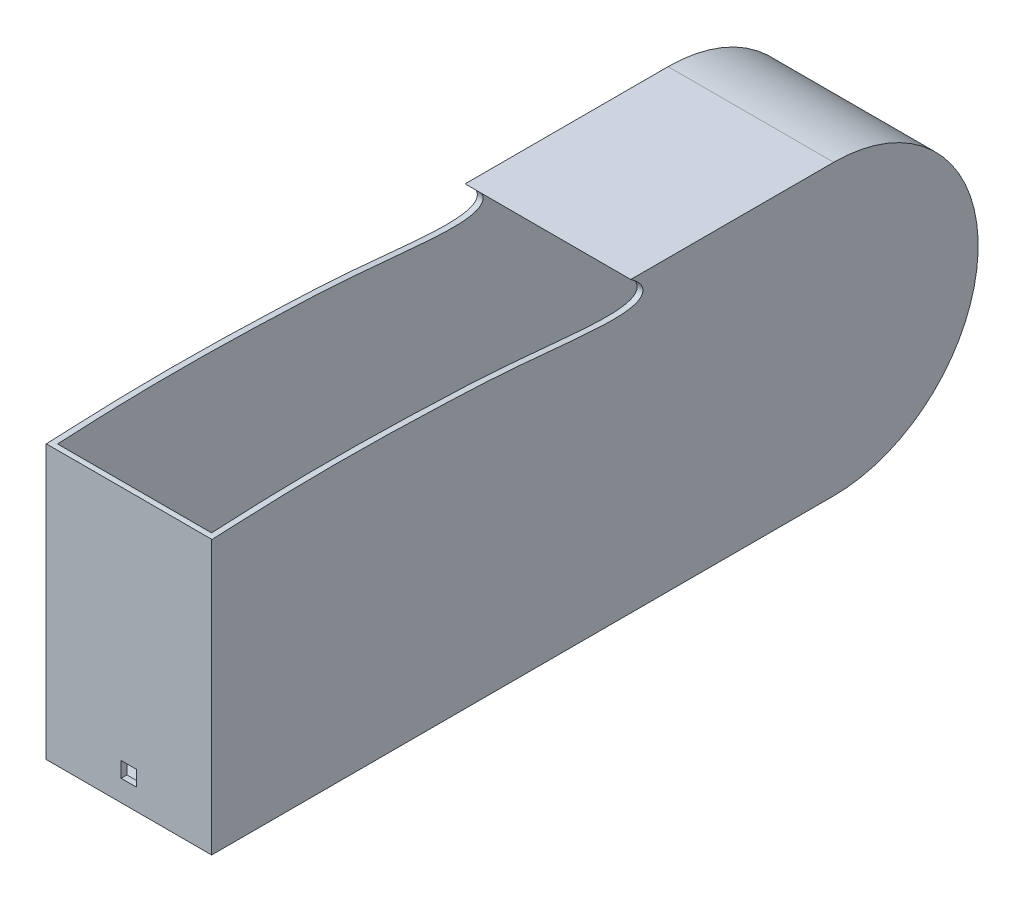
ISO-10303-21;
HEADER;
FILE_DESCRIPTION(('STEP AP214'),'2;1');
FILE_NAME('part.step','',(''),(''),'','','');
FILE_SCHEMA(('AUTOMOTIVE_DESIGN { 1 0 10303 214 1 1 1 1 }'));
ENDSEC;
DATA;
#1=APPLICATION_CONTEXT('core data for automotive mechanical design processes');
#2=APPLICATION_PROTOCOL_DEFINITION('international standard','automotive_design',2000,#1);
#3=PRODUCT_CONTEXT('',#1,'mechanical');
#4=PRODUCT('Part','Part','',(#3));
#5=PRODUCT_RELATED_PRODUCT_CATEGORY('part','',(#4));
#6=PRODUCT_DEFINITION_FORMATION('','',#4);
#7=PRODUCT_DEFINITION_CONTEXT('part definition',#1,'design');
#8=PRODUCT_DEFINITION('design','',#6,#7);
#9=PRODUCT_DEFINITION_SHAPE('','',#8);
#10=(LENGTH_UNIT() NAMED_UNIT(*) SI_UNIT(.MILLI.,.METRE.));
#11=(NAMED_UNIT(*) PLANE_ANGLE_UNIT() SI_UNIT($,.RADIAN.));
#12=(NAMED_UNIT(*) SI_UNIT($,.STERADIAN.) SOLID_ANGLE_UNIT());
#13=UNCERTAINTY_MEASURE_WITH_UNIT(LENGTH_MEASURE(1.E-05),#10,'distance_accuracy_value','');
#14=(GEOMETRIC_REPRESENTATION_CONTEXT(3) GLOBAL_UNCERTAINTY_ASSIGNED_CONTEXT((#13)) GLOBAL_UNIT_ASSIGNED_CONTEXT((#10,
#11,#12)) REPRESENTATION_CONTEXT('',''));
#15=CARTESIAN_POINT('',(0.,0.,0.));
#16=DIRECTION('',(0.,0.,1.));
#17=DIRECTION('',(1.,0.,0.));
#18=AXIS2_PLACEMENT_3D('',#15,#16,#17);
#19=CARTESIAN_POINT('',(-63.5,114.3,0.));
#20=DIRECTION('',(1.,0.,0.));
#21=DIRECTION('',(0.,0.,-1.));
#22=AXIS2_PLACEMENT_3D('',#19,#20,#21);
#23=CYLINDRICAL_SURFACE('',#22,119.0625);
#24=DIRECTION('',(1.,0.,0.));
#25=VECTOR('',#24,1.);
#26=CARTESIAN_POINT('',(-63.5,233.3625,0.));
#27=LINE('',#26,#25);
#28=CARTESIAN_POINT('',(-68.2625,233.3625,0.));
#29=VERTEX_POINT('',#28);
#30=CARTESIAN_POINT('',(68.2625,233.3625,0.));
#31=VERTEX_POINT('',#30);
#32=EDGE_CURVE('E165',#29,#31,#27,.T.);
#33=ORIENTED_EDGE('',*,*,#32,.T.);
#34=CARTESIAN_POINT('',(68.2625,114.3,0.));
#35=DIRECTION('',(1.,0.,0.));
#36=DIRECTION('',(0.,0.,-1.));
#37=AXIS2_PLACEMENT_3D('',#34,#35,#36);
#38=CIRCLE('',#37,119.0625);
#39=CARTESIAN_POINT('',(68.2625,-4.76249999999989,0.));
#40=VERTEX_POINT('',#39);
#41=EDGE_CURVE('E149',#40,#31,#38,.T.);
#42=ORIENTED_EDGE('',*,*,#41,.F.);
#43=DIRECTION('',(1.,0.,0.));
#44=VECTOR('',#43,1.);
#45=CARTESIAN_POINT('',(-63.5,-4.7625,0.));
#46=LINE('',#45,#44);
#47=CARTESIAN_POINT('',(-68.2625,-4.76249999999989,0.));
#48=VERTEX_POINT('',#47);
#49=EDGE_CURVE('E145',#48,#40,#46,.T.);
#50=ORIENTED_EDGE('',*,*,#49,.F.);
#51=CARTESIAN_POINT('',(-68.2625,114.3,0.));
#52=DIRECTION('',(1.,0.,0.));
#53=DIRECTION('',(0.,0.,-1.));
#54=AXIS2_PLACEMENT_3D('',#51,#52,#53);
#55=CIRCLE('',#54,119.0625);
#56=EDGE_CURVE('E147',#48,#29,#55,.T.);
#57=ORIENTED_EDGE('',*,*,#56,.T.);
#58=EDGE_LOOP('',(#33,#42,#50,#57));
#59=FACE_BOUND('',#58,.T.);
#60=ADVANCED_FACE('F41',(#59),#23,.T.);
#61=CARTESIAN_POINT('',(-63.5,-4.7625,0.));
#62=DIRECTION('',(0.,-1.,0.));
#63=DIRECTION('',(0.,0.,-1.));
#64=AXIS2_PLACEMENT_3D('',#61,#62,#63);
#65=PLANE('',#64);
#66=ORIENTED_EDGE('',*,*,#49,.T.);
#67=DIRECTION('',(0.,0.,-1.));
#68=VECTOR('',#67,1.);
#69=CARTESIAN_POINT('',(68.2625,-4.76249999999989,512.7625));
#70=LINE('',#69,#68);
#71=CARTESIAN_POINT('',(68.2625,-4.76249999999989,512.7625));
#72=VERTEX_POINT('',#71);
#73=EDGE_CURVE('E178',#72,#40,#70,.T.);
#74=ORIENTED_EDGE('',*,*,#73,.F.);
#75=DIRECTION('',(1.,0.,0.));
#76=VECTOR('',#75,1.);
#77=CARTESIAN_POINT('',(-63.5,-4.76250000000006,512.7625));
#78=LINE('',#77,#76);
#79=CARTESIAN_POINT('',(-68.2625,-4.76249999999989,512.7625));
#80=VERTEX_POINT('',#79);
#81=EDGE_CURVE('E170',#80,#72,#78,.T.);
#82=ORIENTED_EDGE('',*,*,#81,.F.);
#83=DIRECTION('',(0.,0.,-1.));
#84=VECTOR('',#83,1.);
#85=CARTESIAN_POINT('',(-68.2625,-4.76249999999989,512.7625));
#86=LINE('',#85,#84);
#87=EDGE_CURVE('E155',#80,#48,#86,.T.);
#88=ORIENTED_EDGE('',*,*,#87,.T.);
#89=EDGE_LOOP('',(#66,#74,#82,#88));
#90=FACE_BOUND('',#89,.T.);
#91=ADVANCED_FACE('F168',(#90),#65,.T.);
#92=CARTESIAN_POINT('',(-63.5,-4.76250000000006,512.7625));
#93=DIRECTION('',(0.,0.,1.));
#94=DIRECTION('',(1.,0.,0.));
#95=AXIS2_PLACEMENT_3D('',#92,#93,#94);
#96=PLANE('',#95);
#97=DIRECTION('',(-1.,0.,0.));
#98=VECTOR('',#97,1.);
#99=CARTESIAN_POINT('',(68.2635,220.6625,512.7625));
#100=LINE('',#99,#98);
#101=CARTESIAN_POINT('',(68.2625,220.6625,512.7625));
#102=VERTEX_POINT('',#101);
#103=CARTESIAN_POINT('',(-68.2625,220.6625,512.7625));
#104=VERTEX_POINT('',#103);
#105=EDGE_CURVE('E172',#102,#104,#100,.T.);
#106=ORIENTED_EDGE('',*,*,#105,.T.);
#107=DIRECTION('',(0.,-1.,0.));
#108=VECTOR('',#107,1.);
#109=CARTESIAN_POINT('',(-68.2625,233.3625,512.7625));
#110=LINE('',#109,#108);
#111=EDGE_CURVE('E175',#104,#80,#110,.T.);
#112=ORIENTED_EDGE('',*,*,#111,.T.);
#113=ORIENTED_EDGE('',*,*,#81,.T.);
#114=DIRECTION('',(0.,-1.,0.));
#115=VECTOR('',#114,1.);
#116=CARTESIAN_POINT('',(68.2625,233.3625,512.7625));
#117=LINE('',#116,#115);
#118=EDGE_CURVE('E210',#102,#72,#117,.T.);
#119=ORIENTED_EDGE('',*,*,#118,.F.);
#120=EDGE_LOOP('',(#106,#112,#113,#119));
#121=FACE_BOUND('',#120,.T.);
#122=DIRECTION('',(1.,0.,0.));
#123=VECTOR('',#122,1.);
#124=CARTESIAN_POINT('',(-6.35,12.7,512.7625));
#125=LINE('',#124,#123);
#126=CARTESIAN_POINT('',(-6.35,12.7,512.7625));
#127=VERTEX_POINT('',#126);
#128=CARTESIAN_POINT('',(6.35,12.7,512.7625));
#129=VERTEX_POINT('',#128);
#130=EDGE_CURVE('E268',#127,#129,#125,.T.);
#131=ORIENTED_EDGE('',*,*,#130,.F.);
#132=DIRECTION('',(0.,-1.,0.));
#133=VECTOR('',#132,1.);
#134=CARTESIAN_POINT('',(-6.35,25.4,512.7625));
#135=LINE('',#134,#133);
#136=CARTESIAN_POINT('',(-6.35,25.4,512.7625));
#137=VERTEX_POINT('',#136);
#138=EDGE_CURVE('E229',#137,#127,#135,.T.);
#139=ORIENTED_EDGE('',*,*,#138,.F.);
#140=DIRECTION('',(-1.,0.,0.));
#141=VECTOR('',#140,1.);
#142=CARTESIAN_POINT('',(-6.35,25.4,512.7625));
#143=LINE('',#142,#141);
#144=CARTESIAN_POINT('',(6.35,25.4,512.7625));
#145=VERTEX_POINT('',#144);
#146=EDGE_CURVE('E278',#145,#137,#143,.T.);
#147=ORIENTED_EDGE('',*,*,#146,.F.);
#148=DIRECTION('',(0.,1.,0.));
#149=VECTOR('',#148,1.);
#150=CARTESIAN_POINT('',(6.35,25.4,512.7625));
#151=LINE('',#150,#149);
#152=EDGE_CURVE('E273',#129,#145,#151,.T.);
#153=ORIENTED_EDGE('',*,*,#152,.F.);
#154=EDGE_LOOP('',(#131,#139,#147,#153));
#155=FACE_BOUND('',#154,.T.);
#156=ADVANCED_FACE('F313',(#121,#155),#96,.T.);
#157=CARTESIAN_POINT('',(-63.5,233.3625,512.7625));
#158=DIRECTION('',(0.,1.,0.));
#159=DIRECTION('',(0.,0.,1.));
#160=AXIS2_PLACEMENT_3D('',#157,#158,#159);
#161=PLANE('',#160);
#162=DIRECTION('',(-1.,0.,0.));
#163=VECTOR('',#162,1.);
#164=CARTESIAN_POINT('',(68.2635,233.3625,167.294140697003));
#165=LINE('',#164,#163);
#166=CARTESIAN_POINT('',(-68.2625,233.3625,167.294140697006));
#167=VERTEX_POINT('',#166);
#168=CARTESIAN_POINT('',(68.2625,233.3625,167.294140697006));
#169=VERTEX_POINT('',#168);
#170=EDGE_CURVE('E86',#167,#169,#165,.F.);
#171=ORIENTED_EDGE('',*,*,#170,.T.);
#172=DIRECTION('',(0.,0.,1.));
#173=VECTOR('',#172,1.);
#174=CARTESIAN_POINT('',(68.2625,233.3625,512.7625));
#175=LINE('',#174,#173);
#176=EDGE_CURVE('E197',#31,#169,#175,.T.);
#177=ORIENTED_EDGE('',*,*,#176,.F.);
#178=ORIENTED_EDGE('',*,*,#32,.F.);
#179=DIRECTION('',(0.,0.,1.));
#180=VECTOR('',#179,1.);
#181=CARTESIAN_POINT('',(-68.2625,233.3625,512.7625));
#182=LINE('',#181,#180);
#183=EDGE_CURVE('E163',#29,#167,#182,.T.);
#184=ORIENTED_EDGE('',*,*,#183,.T.);
#185=EDGE_LOOP('',(#171,#177,#178,#184));
#186=FACE_BOUND('',#185,.T.);
#187=ADVANCED_FACE('F362',(#186),#161,.T.);
#188=CARTESIAN_POINT('',(-63.5,114.3,0.));
#189=DIRECTION('',(1.,0.,0.));
#190=DIRECTION('',(0.,0.,-1.));
#191=AXIS2_PLACEMENT_3D('',#188,#189,#190);
#192=CYLINDRICAL_SURFACE('',#191,114.3);
#193=DIRECTION('',(1.,0.,0.));
#194=VECTOR('',#193,1.);
#195=CARTESIAN_POINT('',(-63.5,0.,0.));
#196=LINE('',#195,#194);
#197=CARTESIAN_POINT('',(-63.5,0.,0.));
#198=VERTEX_POINT('',#197);
#199=CARTESIAN_POINT('',(63.5,0.,0.));
#200=VERTEX_POINT('',#199);
#201=EDGE_CURVE('E216',#198,#200,#196,.T.);
#202=ORIENTED_EDGE('',*,*,#201,.T.);
#203=CARTESIAN_POINT('',(63.5,114.3,0.));
#204=DIRECTION('',(1.,0.,0.));
#205=DIRECTION('',(0.,0.,-1.));
#206=AXIS2_PLACEMENT_3D('',#203,#204,#205);
#207=CIRCLE('',#206,114.3);
#208=CARTESIAN_POINT('',(63.5,228.6,0.));
#209=VERTEX_POINT('',#208);
#210=EDGE_CURVE('E261',#200,#209,#207,.T.);
#211=ORIENTED_EDGE('',*,*,#210,.T.);
#212=DIRECTION('',(1.,0.,0.));
#213=VECTOR('',#212,1.);
#214=CARTESIAN_POINT('',(-63.5,228.6,0.));
#215=LINE('',#214,#213);
#216=CARTESIAN_POINT('',(-63.5,228.6,0.));
#217=VERTEX_POINT('',#216);
#218=EDGE_CURVE('E206',#217,#209,#215,.T.);
#219=ORIENTED_EDGE('',*,*,#218,.F.);
#220=CARTESIAN_POINT('',(-63.5,114.3,0.));
#221=DIRECTION('',(1.,0.,0.));
#222=DIRECTION('',(0.,0.,-1.));
#223=AXIS2_PLACEMENT_3D('',#220,#221,#222);
#224=CIRCLE('',#223,114.3);
#225=EDGE_CURVE('E243',#198,#217,#224,.T.);
#226=ORIENTED_EDGE('',*,*,#225,.F.);
#227=EDGE_LOOP('',(#202,#211,#219,#226));
#228=FACE_BOUND('',#227,.T.);
#229=ADVANCED_FACE('F327',(#228),#192,.F.);
#230=CARTESIAN_POINT('',(-63.5,0.,0.));
#231=DIRECTION('',(0.,-1.,0.));
#232=DIRECTION('',(0.,0.,-1.));
#233=AXIS2_PLACEMENT_3D('',#230,#231,#232);
#234=PLANE('',#233);
#235=DIRECTION('',(1.,0.,0.));
#236=VECTOR('',#235,1.);
#237=CARTESIAN_POINT('',(-63.5,0.,508.));
#238=LINE('',#237,#236);
#239=CARTESIAN_POINT('',(-63.5,0.,508.));
#240=VERTEX_POINT('',#239);
#241=CARTESIAN_POINT('',(63.5,0.,508.));
#242=VERTEX_POINT('',#241);
#243=EDGE_CURVE('E260',#240,#242,#238,.T.);
#244=ORIENTED_EDGE('',*,*,#243,.T.);
#245=DIRECTION('',(0.,0.,-1.));
#246=VECTOR('',#245,1.);
#247=CARTESIAN_POINT('',(63.5,0.,0.));
#248=LINE('',#247,#246);
#249=EDGE_CURVE('E202',#242,#200,#248,.T.);
#250=ORIENTED_EDGE('',*,*,#249,.T.);
#251=ORIENTED_EDGE('',*,*,#201,.F.);
#252=DIRECTION('',(0.,0.,-1.));
#253=VECTOR('',#252,1.);
#254=CARTESIAN_POINT('',(-63.5,0.,0.));
#255=LINE('',#254,#253);
#256=EDGE_CURVE('E191',#240,#198,#255,.T.);
#257=ORIENTED_EDGE('',*,*,#256,.F.);
#258=EDGE_LOOP('',(#244,#250,#251,#257));
#259=FACE_BOUND('',#258,.T.);
#260=ADVANCED_FACE('F331',(#259),#234,.F.);
#261=CARTESIAN_POINT('',(-63.5,0.,508.));
#262=DIRECTION('',(0.,0.,1.));
#263=DIRECTION('',(1.,0.,0.));
#264=AXIS2_PLACEMENT_3D('',#261,#262,#263);
#265=PLANE('',#264);
#266=DIRECTION('',(0.,1.,0.));
#267=VECTOR('',#266,1.);
#268=CARTESIAN_POINT('',(-6.35,25.4,508.));
#269=LINE('',#268,#267);
#270=CARTESIAN_POINT('',(-6.35,12.7,508.));
#271=VERTEX_POINT('',#270);
#272=CARTESIAN_POINT('',(-6.35,25.4,508.));
#273=VERTEX_POINT('',#272);
#274=EDGE_CURVE('E284',#271,#273,#269,.T.);
#275=ORIENTED_EDGE('',*,*,#274,.F.);
#276=DIRECTION('',(-1.,0.,0.));
#277=VECTOR('',#276,1.);
#278=CARTESIAN_POINT('',(-6.35,12.7,508.));
#279=LINE('',#278,#277);
#280=CARTESIAN_POINT('',(6.35,12.7,508.));
#281=VERTEX_POINT('',#280);
#282=EDGE_CURVE('E269',#281,#271,#279,.T.);
#283=ORIENTED_EDGE('',*,*,#282,.F.);
#284=DIRECTION('',(0.,-1.,0.));
#285=VECTOR('',#284,1.);
#286=CARTESIAN_POINT('',(6.35,25.4,508.));
#287=LINE('',#286,#285);
#288=CARTESIAN_POINT('',(6.35,25.4,508.));
#289=VERTEX_POINT('',#288);
#290=EDGE_CURVE('E274',#289,#281,#287,.T.);
#291=ORIENTED_EDGE('',*,*,#290,.F.);
#292=DIRECTION('',(1.,0.,0.));
#293=VECTOR('',#292,1.);
#294=CARTESIAN_POINT('',(-6.35,25.4,508.));
#295=LINE('',#294,#293);
#296=EDGE_CURVE('E279',#273,#289,#295,.T.);
#297=ORIENTED_EDGE('',*,*,#296,.F.);
#298=EDGE_LOOP('',(#275,#283,#291,#297));
#299=FACE_BOUND('',#298,.T.);
#300=DIRECTION('',(0.,-1.,0.));
#301=VECTOR('',#300,1.);
#302=CARTESIAN_POINT('',(-63.5,0.,508.));
#303=LINE('',#302,#301);
#304=CARTESIAN_POINT('',(-63.5,220.431417677347,508.));
#305=VERTEX_POINT('',#304);
#306=EDGE_CURVE('E188',#305,#240,#303,.T.);
#307=ORIENTED_EDGE('',*,*,#306,.F.);
#308=DIRECTION('',(-1.,0.,0.));
#309=VECTOR('',#308,1.);
#310=CARTESIAN_POINT('',(68.2635,220.431417677364,508.));
#311=LINE('',#310,#309);
#312=CARTESIAN_POINT('',(63.5,220.431417677347,508.000000003168));
#313=VERTEX_POINT('',#312);
#314=EDGE_CURVE('E183',#313,#305,#311,.T.);
#315=ORIENTED_EDGE('',*,*,#314,.F.);
#316=DIRECTION('',(0.,-1.,0.));
#317=VECTOR('',#316,1.);
#318=CARTESIAN_POINT('',(63.5,0.,508.));
#319=LINE('',#318,#317);
#320=EDGE_CURVE('E198',#313,#242,#319,.T.);
#321=ORIENTED_EDGE('',*,*,#320,.T.);
#322=ORIENTED_EDGE('',*,*,#243,.F.);
#323=EDGE_LOOP('',(#307,#315,#321,#322));
#324=FACE_BOUND('',#323,.T.);
#325=ADVANCED_FACE('F43',(#299,#324),#265,.F.);
#326=CARTESIAN_POINT('',(-63.5,228.6,508.));
#327=DIRECTION('',(0.,1.,0.));
#328=DIRECTION('',(0.,0.,1.));
#329=AXIS2_PLACEMENT_3D('',#326,#327,#328);
#330=PLANE('',#329);
#331=DIRECTION('',(0.,0.,1.));
#332=VECTOR('',#331,1.);
#333=CARTESIAN_POINT('',(63.5,228.6,508.));
#334=LINE('',#333,#332);
#335=CARTESIAN_POINT('',(63.5,228.600000000172,161.549426199664));
#336=VERTEX_POINT('',#335);
#337=EDGE_CURVE('E201',#209,#336,#334,.T.);
#338=ORIENTED_EDGE('',*,*,#337,.T.);
#339=DIRECTION('',(-1.,0.,0.));
#340=VECTOR('',#339,1.);
#341=CARTESIAN_POINT('',(68.2635,228.6,161.549426199493));
#342=LINE('',#341,#340);
#343=CARTESIAN_POINT('',(-63.5,228.6,161.549426199664));
#344=VERTEX_POINT('',#343);
#345=EDGE_CURVE('E54',#344,#336,#342,.F.);
#346=ORIENTED_EDGE('',*,*,#345,.F.);
#347=DIRECTION('',(0.,0.,1.));
#348=VECTOR('',#347,1.);
#349=CARTESIAN_POINT('',(-63.5,228.6,508.));
#350=LINE('',#349,#348);
#351=EDGE_CURVE('E193',#217,#344,#350,.T.);
#352=ORIENTED_EDGE('',*,*,#351,.F.);
#353=ORIENTED_EDGE('',*,*,#218,.T.);
#354=EDGE_LOOP('',(#338,#346,#352,#353));
#355=FACE_BOUND('',#354,.T.);
#356=ADVANCED_FACE('F339',(#355),#330,.F.);
#357=CARTESIAN_POINT('',(-6.35,12.7,-119.0635));
#358=DIRECTION('',(0.,-1.,0.));
#359=DIRECTION('',(0.,0.,-1.));
#360=AXIS2_PLACEMENT_3D('',#357,#358,#359);
#361=PLANE('',#360);
#362=ORIENTED_EDGE('',*,*,#282,.T.);
#363=DIRECTION('',(0.,0.,1.));
#364=VECTOR('',#363,1.);
#365=CARTESIAN_POINT('',(-6.35,12.7,-119.0635));
#366=LINE('',#365,#364);
#367=EDGE_CURVE('E265',#271,#127,#366,.T.);
#368=ORIENTED_EDGE('',*,*,#367,.T.);
#369=ORIENTED_EDGE('',*,*,#130,.T.);
#370=DIRECTION('',(0.,0.,1.));
#371=VECTOR('',#370,1.);
#372=CARTESIAN_POINT('',(6.35,12.7,-119.0635));
#373=LINE('',#372,#371);
#374=EDGE_CURVE('E270',#281,#129,#373,.T.);
#375=ORIENTED_EDGE('',*,*,#374,.F.);
#376=EDGE_LOOP('',(#362,#368,#369,#375));
#377=FACE_BOUND('',#376,.T.);
#378=ADVANCED_FACE('F351',(#377),#361,.F.);
#379=CARTESIAN_POINT('',(6.35,25.4,-119.0635));
#380=DIRECTION('',(1.,0.,0.));
#381=DIRECTION('',(0.,1.,0.));
#382=AXIS2_PLACEMENT_3D('',#379,#380,#381);
#383=PLANE('',#382);
#384=ORIENTED_EDGE('',*,*,#290,.T.);
#385=ORIENTED_EDGE('',*,*,#374,.T.);
#386=ORIENTED_EDGE('',*,*,#152,.T.);
#387=DIRECTION('',(0.,0.,1.));
#388=VECTOR('',#387,1.);
#389=CARTESIAN_POINT('',(6.35,25.4,-119.0635));
#390=LINE('',#389,#388);
#391=EDGE_CURVE('E275',#289,#145,#390,.T.);
#392=ORIENTED_EDGE('',*,*,#391,.F.);
#393=EDGE_LOOP('',(#384,#385,#386,#392));
#394=FACE_BOUND('',#393,.T.);
#395=ADVANCED_FACE('F366',(#394),#383,.F.);
#396=CARTESIAN_POINT('',(-6.35,25.4,-119.0635));
#397=DIRECTION('',(0.,1.,0.));
#398=DIRECTION('',(0.,0.,1.));
#399=AXIS2_PLACEMENT_3D('',#396,#397,#398);
#400=PLANE('',#399);
#401=ORIENTED_EDGE('',*,*,#296,.T.);
#402=ORIENTED_EDGE('',*,*,#391,.T.);
#403=ORIENTED_EDGE('',*,*,#146,.T.);
#404=DIRECTION('',(0.,0.,1.));
#405=VECTOR('',#404,1.);
#406=CARTESIAN_POINT('',(-6.35,25.4,-119.0635));
#407=LINE('',#406,#405);
#408=EDGE_CURVE('E280',#273,#137,#407,.T.);
#409=ORIENTED_EDGE('',*,*,#408,.F.);
#410=EDGE_LOOP('',(#401,#402,#403,#409));
#411=FACE_BOUND('',#410,.T.);
#412=ADVANCED_FACE('F370',(#411),#400,.F.);
#413=CARTESIAN_POINT('',(-6.35,25.4,-119.0635));
#414=DIRECTION('',(-1.,0.,0.));
#415=DIRECTION('',(0.,-1.,0.));
#416=AXIS2_PLACEMENT_3D('',#413,#414,#415);
#417=PLANE('',#416);
#418=ORIENTED_EDGE('',*,*,#274,.T.);
#419=ORIENTED_EDGE('',*,*,#408,.T.);
#420=ORIENTED_EDGE('',*,*,#138,.T.);
#421=ORIENTED_EDGE('',*,*,#367,.F.);
#422=EDGE_LOOP('',(#418,#419,#420,#421));
#423=FACE_BOUND('',#422,.T.);
#424=ADVANCED_FACE('F374',(#423),#417,.F.);
#425=CARTESIAN_POINT('',(63.5,114.3,0.));
#426=DIRECTION('',(1.,0.,0.));
#427=DIRECTION('',(0.,0.,-1.));
#428=AXIS2_PLACEMENT_3D('',#425,#426,#427);
#429=PLANE('',#428);
#430=ORIENTED_EDGE('',*,*,#320,.F.);
#431=CARTESIAN_POINT('',(63.5,221.103452286152,512.849393222915));
#432=CARTESIAN_POINT('',(63.5,221.211009465947,512.532700594571));
#433=CARTESIAN_POINT('',(63.5,221.639549780142,511.270901440742));
#434=CARTESIAN_POINT('',(63.5,222.600485882355,508.446421090202));
#435=CARTESIAN_POINT('',(63.5,224.150302438679,503.762953516682));
#436=CARTESIAN_POINT('',(63.5,226.259749177724,497.269998463607));
#437=CARTESIAN_POINT('',(63.5,228.841368447249,489.023245355379));
#438=CARTESIAN_POINT('',(63.5,231.81387248124,479.100004809874));
#439=CARTESIAN_POINT('',(63.5,235.083165456711,467.59797869617));
#440=CARTESIAN_POINT('',(63.5,238.545255757918,454.628032508214));
#441=CARTESIAN_POINT('',(63.5,242.094575025628,440.321148985206));
#442=CARTESIAN_POINT('',(63.5,245.617549826205,424.821429797442));
#443=CARTESIAN_POINT('',(63.5,249.024771645133,408.29492793284));
#444=CARTESIAN_POINT('',(63.5,252.204320359588,390.914504443241));
#445=CARTESIAN_POINT('',(63.5,255.061254060712,372.867862768213));
#446=CARTESIAN_POINT('',(63.5,257.520201331038,354.353343741063));
#447=CARTESIAN_POINT('',(63.5,259.500514547056,335.579209388613));
#448=CARTESIAN_POINT('',(63.5,260.937616248262,316.747059387589));
#449=CARTESIAN_POINT('',(63.5,261.853164617752,297.941819280323));
#450=CARTESIAN_POINT('',(63.5,261.889242871964,279.366079575412));
#451=CARTESIAN_POINT('',(63.5,260.902418125429,261.280070346122));
#452=CARTESIAN_POINT('',(63.5,258.9850339095,244.058757052741));
#453=CARTESIAN_POINT('',(63.5,256.246806811277,227.929585220945));
#454=CARTESIAN_POINT('',(63.5,252.805079968523,213.104456805843));
#455=CARTESIAN_POINT('',(63.5,248.825528286306,199.768656160671));
#456=CARTESIAN_POINT('',(63.5,244.484590441484,188.077495343327));
#457=CARTESIAN_POINT('',(63.5,239.956374948211,178.156217252056));
#458=CARTESIAN_POINT('',(63.5,235.414103693613,170.09820162353));
#459=CARTESIAN_POINT('',(63.5,231.01719821287,163.938608789046));
#460=CARTESIAN_POINT('',(63.5,226.860803831245,159.710140528779));
#461=CARTESIAN_POINT('',(63.5,222.931348779444,157.282866367302));
#462=CARTESIAN_POINT('',(63.5,218.986296857464,157.078551080553));
#463=CARTESIAN_POINT('',(63.5,215.836723638551,159.430374501547));
#464=CARTESIAN_POINT('',(63.5,213.876038864295,163.53769494019));
#465=CARTESIAN_POINT('',(63.5,212.601675942051,169.178489437126));
#466=CARTESIAN_POINT('',(63.5,211.952589942483,176.44143193666));
#467=CARTESIAN_POINT('',(63.5,211.854882503057,185.254497432608));
#468=CARTESIAN_POINT('',(63.5,212.250908039219,195.533579012899));
#469=CARTESIAN_POINT('',(63.5,213.053608959908,207.163351660636));
#470=CARTESIAN_POINT('',(63.5,214.173533720422,220.024740235377));
#471=CARTESIAN_POINT('',(63.5,215.488554616551,233.993166749208));
#472=CARTESIAN_POINT('',(63.5,216.890924890213,248.94317648004));
#473=CARTESIAN_POINT('',(63.5,218.264163949801,264.74570999627));
#474=CARTESIAN_POINT('',(63.5,219.486485378968,281.270044113907));
#475=CARTESIAN_POINT('',(63.5,220.428545699325,298.511284991632));
#476=CARTESIAN_POINT('',(63.5,221.118607839099,316.315771526671));
#477=CARTESIAN_POINT('',(63.5,221.829251020905,334.495805294187));
#478=CARTESIAN_POINT('',(63.5,222.413221362861,352.735682057207));
#479=CARTESIAN_POINT('',(63.5,222.857510837363,370.831925378719));
#480=CARTESIAN_POINT('',(63.5,223.140033413405,388.591608724487));
#481=CARTESIAN_POINT('',(63.5,223.252027693137,405.819175726337));
#482=CARTESIAN_POINT('',(63.5,223.203320199009,422.322545068698));
#483=CARTESIAN_POINT('',(63.5,223.020606611835,437.915565220504));
#484=CARTESIAN_POINT('',(63.5,222.71075189044,452.418364345008));
#485=CARTESIAN_POINT('',(63.5,222.338100855146,465.660747498458));
#486=CARTESIAN_POINT('',(63.5,221.908988988218,477.491371257319));
#487=CARTESIAN_POINT('',(63.5,221.495841486537,487.744754132704));
#488=CARTESIAN_POINT('',(63.5,221.047668799869,496.366215664096));
#489=CARTESIAN_POINT('',(63.5,220.841691742326,503.05364095758));
#490=CARTESIAN_POINT('',(63.5,220.266487962213,508.205599592566));
#491=CARTESIAN_POINT('',(63.5,220.648579963455,510.755855293674));
#492=CARTESIAN_POINT('',(63.5,219.934638372019,512.72299084249));
#493=CARTESIAN_POINT('',(63.5,220.490245124887,512.753149809345));
#494=CARTESIAN_POINT('',(63.5,220.6625,512.7625));
#495=B_SPLINE_CURVE_WITH_KNOTS('',3,(#431,#432,#433,#434,#435,#436,#437,#438,#439,#440,#441,
#442,#443,#444,#445,#446,#447,#448,#449,#450,#451,#452,#453,#454,#455,#456,#457,#458,#459,#460,
#461,#462,#463,#464,#465,#466,#467,#468,#469,#470,#471,#472,#473,#474,#475,#476,#477,#478,#479,
#480,#481,#482,#483,#484,#485,#486,#487,#488,#489,#490,#491,#492,#493,#494),.UNSPECIFIED.,.F.,
.F.,(4,1,1,1,1,1,1,1,1,1,1,1,1,1,1,1,1,1,1,1,1,1,1,1,1,1,1,1,1,1,1,1,1,1,1,1,1,1,1,1,1,1,1,1,1,
1,1,1,1,1,1,1,1,1,1,1,1,1,1,1,1,4),(0.,0.0013715766250261,0.00546477584250823,
0.0122348018502247,0.0216019692657692,0.0334613445682541,0.0476712497544171,0.0640813180473265,
0.082496261138008,0.102719148689264,0.124527079157664,0.14767564836169,0.171912572572513,
0.196978379588112,0.222596912267761,0.248496766675201,0.274385100810321,0.300041178316028,
0.325689987882079,0.350525087532111,0.374279703233646,0.39671125377608,0.41757673414408,
0.436654005915541,0.45374438973928,0.468679993939526,0.481329415272233,0.491630702034347,
0.499615788540128,0.50554628117804,0.510184984462959,0.514824193684277,0.520701508332397,
0.528516039729706,0.538465751713385,0.55054260931231,0.564643256443601,0.580638139182816,
0.598344876375769,0.617584458372554,0.638174400803704,0.659922089978603,0.682632113153432,
0.706120665440723,0.730727382957721,0.755700243562022,0.780731768779878,0.805564462972336,
0.829932395841959,0.853570292180875,0.876213105152017,0.897609986535304,0.917519393525195,
0.93569834721614,0.951942678095032,0.966047158851578,0.977839939974046,0.987174001699795,
0.993931500880097,0.998018399437236,0.999385643972647,1.),.UNSPECIFIED.);
#496=EDGE_CURVE('E11',#336,#313,#495,.T.);
#497=ORIENTED_EDGE('',*,*,#496,.F.);
#498=ORIENTED_EDGE('',*,*,#337,.F.);
#499=ORIENTED_EDGE('',*,*,#210,.F.);
#500=ORIENTED_EDGE('',*,*,#249,.F.);
#501=EDGE_LOOP('',(#430,#497,#498,#499,#500));
#502=FACE_BOUND('',#501,.T.);
#503=ADVANCED_FACE('F335',(#502),#429,.F.);
#504=CARTESIAN_POINT('',(68.2625,114.3,0.));
#505=DIRECTION('',(1.,0.,0.));
#506=DIRECTION('',(0.,0.,-1.));
#507=AXIS2_PLACEMENT_3D('',#504,#505,#506);
#508=PLANE('',#507);
#509=CARTESIAN_POINT('',(68.2625,221.103452286152,512.849393222915));
#510=CARTESIAN_POINT('',(68.2625,221.211009465947,512.532700594571));
#511=CARTESIAN_POINT('',(68.2625,221.639549780142,511.270901440742));
#512=CARTESIAN_POINT('',(68.2625,222.600485882355,508.446421090202));
#513=CARTESIAN_POINT('',(68.2625,224.150302438679,503.762953516682));
#514=CARTESIAN_POINT('',(68.2625,226.259749177724,497.269998463607));
#515=CARTESIAN_POINT('',(68.2625,228.841368447249,489.023245355379));
#516=CARTESIAN_POINT('',(68.2625,231.81387248124,479.100004809874));
#517=CARTESIAN_POINT('',(68.2625,235.083165456711,467.59797869617));
#518=CARTESIAN_POINT('',(68.2625,238.545255757918,454.628032508214));
#519=CARTESIAN_POINT('',(68.2625,242.094575025628,440.321148985206));
#520=CARTESIAN_POINT('',(68.2625,245.617549826205,424.821429797442));
#521=CARTESIAN_POINT('',(68.2625,249.024771645133,408.29492793284));
#522=CARTESIAN_POINT('',(68.2625,252.204320359588,390.914504443241));
#523=CARTESIAN_POINT('',(68.2625,255.061254060712,372.867862768213));
#524=CARTESIAN_POINT('',(68.2625,257.520201331038,354.353343741063));
#525=CARTESIAN_POINT('',(68.2625,259.500514547056,335.579209388613));
#526=CARTESIAN_POINT('',(68.2625,260.937616248262,316.747059387589));
#527=CARTESIAN_POINT('',(68.2625,261.853164617752,297.941819280323));
#528=CARTESIAN_POINT('',(68.2625,261.889242871964,279.366079575412));
#529=CARTESIAN_POINT('',(68.2625,260.902418125429,261.280070346122));
#530=CARTESIAN_POINT('',(68.2625,258.9850339095,244.058757052741));
#531=CARTESIAN_POINT('',(68.2625,256.246806811277,227.929585220945));
#532=CARTESIAN_POINT('',(68.2625,252.805079968523,213.104456805843));
#533=CARTESIAN_POINT('',(68.2625,248.825528286306,199.768656160671));
#534=CARTESIAN_POINT('',(68.2625,244.484590441484,188.077495343327));
#535=CARTESIAN_POINT('',(68.2625,239.956374948211,178.156217252056));
#536=CARTESIAN_POINT('',(68.2625,235.414103693613,170.09820162353));
#537=CARTESIAN_POINT('',(68.2625,231.01719821287,163.938608789046));
#538=CARTESIAN_POINT('',(68.2625,226.860803831245,159.710140528779));
#539=CARTESIAN_POINT('',(68.2625,222.931348779444,157.282866367302));
#540=CARTESIAN_POINT('',(68.2625,218.986296857464,157.078551080553));
#541=CARTESIAN_POINT('',(68.2625,215.836723638551,159.430374501547));
#542=CARTESIAN_POINT('',(68.2625,213.876038864295,163.53769494019));
#543=CARTESIAN_POINT('',(68.2625,212.601675942051,169.178489437126));
#544=CARTESIAN_POINT('',(68.2625,211.952589942483,176.44143193666));
#545=CARTESIAN_POINT('',(68.2625,211.854882503057,185.254497432608));
#546=CARTESIAN_POINT('',(68.2625,212.250908039219,195.533579012899));
#547=CARTESIAN_POINT('',(68.2625,213.053608959908,207.163351660636));
#548=CARTESIAN_POINT('',(68.2625,214.173533720422,220.024740235377));
#549=CARTESIAN_POINT('',(68.2625,215.488554616551,233.993166749208));
#550=CARTESIAN_POINT('',(68.2625,216.890924890213,248.94317648004));
#551=CARTESIAN_POINT('',(68.2625,218.264163949801,264.74570999627));
#552=CARTESIAN_POINT('',(68.2625,219.486485378968,281.270044113907));
#553=CARTESIAN_POINT('',(68.2625,220.428545699325,298.511284991632));
#554=CARTESIAN_POINT('',(68.2625,221.118607839099,316.315771526671));
#555=CARTESIAN_POINT('',(68.2625,221.829251020905,334.495805294187));
#556=CARTESIAN_POINT('',(68.2625,222.413221362861,352.735682057207));
#557=CARTESIAN_POINT('',(68.2625,222.857510837363,370.831925378719));
#558=CARTESIAN_POINT('',(68.2625,223.140033413405,388.591608724487));
#559=CARTESIAN_POINT('',(68.2625,223.252027693137,405.819175726337));
#560=CARTESIAN_POINT('',(68.2625,223.203320199009,422.322545068698));
#561=CARTESIAN_POINT('',(68.2625,223.020606611835,437.915565220504));
#562=CARTESIAN_POINT('',(68.2625,222.71075189044,452.418364345008));
#563=CARTESIAN_POINT('',(68.2625,222.338100855146,465.660747498458));
#564=CARTESIAN_POINT('',(68.2625,221.908988988218,477.491371257319));
#565=CARTESIAN_POINT('',(68.2625,221.495841486537,487.744754132704));
#566=CARTESIAN_POINT('',(68.2625,221.047668799869,496.366215664096));
#567=CARTESIAN_POINT('',(68.2625,220.841691742326,503.05364095758));
#568=CARTESIAN_POINT('',(68.2625,220.266487962213,508.205599592566));
#569=CARTESIAN_POINT('',(68.2625,220.648579963455,510.755855293674));
#570=CARTESIAN_POINT('',(68.2625,219.934638372019,512.72299084249));
#571=CARTESIAN_POINT('',(68.2625,220.490245124887,512.753149809345));
#572=CARTESIAN_POINT('',(68.2625,220.6625,512.7625));
#573=B_SPLINE_CURVE_WITH_KNOTS('',3,(#509,#510,#511,#512,#513,#514,#515,#516,#517,#518,#519,
#520,#521,#522,#523,#524,#525,#526,#527,#528,#529,#530,#531,#532,#533,#534,#535,#536,#537,#538,
#539,#540,#541,#542,#543,#544,#545,#546,#547,#548,#549,#550,#551,#552,#553,#554,#555,#556,#557,
#558,#559,#560,#561,#562,#563,#564,#565,#566,#567,#568,#569,#570,#571,#572),.UNSPECIFIED.,.F.,
.F.,(4,1,1,1,1,1,1,1,1,1,1,1,1,1,1,1,1,1,1,1,1,1,1,1,1,1,1,1,1,1,1,1,1,1,1,1,1,1,1,1,1,1,1,1,1,
1,1,1,1,1,1,1,1,1,1,1,1,1,1,1,1,4),(0.,0.0013715766250261,0.00546477584250823,
0.0122348018502247,0.0216019692657692,0.0334613445682541,0.0476712497544171,0.0640813180473265,
0.082496261138008,0.102719148689264,0.124527079157664,0.14767564836169,0.171912572572513,
0.196978379588112,0.222596912267761,0.248496766675201,0.274385100810321,0.300041178316028,
0.325689987882079,0.350525087532111,0.374279703233646,0.39671125377608,0.41757673414408,
0.436654005915541,0.45374438973928,0.468679993939526,0.481329415272233,0.491630702034347,
0.499615788540128,0.50554628117804,0.510184984462959,0.514824193684277,0.520701508332397,
0.528516039729706,0.538465751713385,0.55054260931231,0.564643256443601,0.580638139182816,
0.598344876375769,0.617584458372554,0.638174400803704,0.659922089978603,0.682632113153432,
0.706120665440723,0.730727382957721,0.755700243562022,0.780731768779878,0.805564462972336,
0.829932395841959,0.853570292180875,0.876213105152017,0.897609986535304,0.917519393525195,
0.93569834721614,0.951942678095032,0.966047158851578,0.977839939974046,0.987174001699795,
0.993931500880097,0.998018399437236,0.999385643972647,1.),.UNSPECIFIED.);
#574=EDGE_CURVE('E213',#169,#102,#573,.T.);
#575=ORIENTED_EDGE('',*,*,#574,.T.);
#576=ORIENTED_EDGE('',*,*,#118,.T.);
#577=ORIENTED_EDGE('',*,*,#73,.T.);
#578=ORIENTED_EDGE('',*,*,#41,.T.);
#579=ORIENTED_EDGE('',*,*,#176,.T.);
#580=EDGE_LOOP('',(#575,#576,#577,#578,#579));
#581=FACE_BOUND('',#580,.T.);
#582=ADVANCED_FACE('F310',(#581),#508,.T.);
#583=CARTESIAN_POINT('',(-63.5,114.3,0.));
#584=DIRECTION('',(-1.,0.,0.));
#585=DIRECTION('',(0.,0.,-1.));
#586=AXIS2_PLACEMENT_3D('',#583,#584,#585);
#587=PLANE('',#586);
#588=ORIENTED_EDGE('',*,*,#351,.T.);
#589=CARTESIAN_POINT('',(-63.5,221.103452286152,512.849393222915));
#590=CARTESIAN_POINT('',(-63.5,221.211009465947,512.532700594571));
#591=CARTESIAN_POINT('',(-63.5,221.639549780142,511.270901440742));
#592=CARTESIAN_POINT('',(-63.5,222.600485882355,508.446421090202));
#593=CARTESIAN_POINT('',(-63.5,224.150302438679,503.762953516682));
#594=CARTESIAN_POINT('',(-63.5,226.259749177724,497.269998463607));
#595=CARTESIAN_POINT('',(-63.5,228.841368447249,489.023245355379));
#596=CARTESIAN_POINT('',(-63.5,231.81387248124,479.100004809874));
#597=CARTESIAN_POINT('',(-63.5,235.083165456711,467.59797869617));
#598=CARTESIAN_POINT('',(-63.5,238.545255757918,454.628032508214));
#599=CARTESIAN_POINT('',(-63.5,242.094575025628,440.321148985206));
#600=CARTESIAN_POINT('',(-63.5,245.617549826205,424.821429797442));
#601=CARTESIAN_POINT('',(-63.5,249.024771645133,408.29492793284));
#602=CARTESIAN_POINT('',(-63.5,252.204320359588,390.914504443241));
#603=CARTESIAN_POINT('',(-63.5,255.061254060712,372.867862768213));
#604=CARTESIAN_POINT('',(-63.5,257.520201331038,354.353343741063));
#605=CARTESIAN_POINT('',(-63.5,259.500514547056,335.579209388613));
#606=CARTESIAN_POINT('',(-63.5,260.937616248262,316.747059387589));
#607=CARTESIAN_POINT('',(-63.5,261.853164617752,297.941819280323));
#608=CARTESIAN_POINT('',(-63.5,261.889242871964,279.366079575412));
#609=CARTESIAN_POINT('',(-63.5,260.902418125429,261.280070346122));
#610=CARTESIAN_POINT('',(-63.5,258.9850339095,244.058757052741));
#611=CARTESIAN_POINT('',(-63.5,256.246806811277,227.929585220945));
#612=CARTESIAN_POINT('',(-63.5,252.805079968523,213.104456805843));
#613=CARTESIAN_POINT('',(-63.5,248.825528286306,199.768656160671));
#614=CARTESIAN_POINT('',(-63.5,244.484590441484,188.077495343327));
#615=CARTESIAN_POINT('',(-63.5,239.956374948211,178.156217252056));
#616=CARTESIAN_POINT('',(-63.5,235.414103693613,170.09820162353));
#617=CARTESIAN_POINT('',(-63.5,231.01719821287,163.938608789046));
#618=CARTESIAN_POINT('',(-63.5,226.860803831245,159.710140528779));
#619=CARTESIAN_POINT('',(-63.5,222.931348779444,157.282866367302));
#620=CARTESIAN_POINT('',(-63.5,218.986296857464,157.078551080553));
#621=CARTESIAN_POINT('',(-63.5,215.836723638551,159.430374501547));
#622=CARTESIAN_POINT('',(-63.5,213.876038864295,163.53769494019));
#623=CARTESIAN_POINT('',(-63.5,212.601675942051,169.178489437126));
#624=CARTESIAN_POINT('',(-63.5,211.952589942483,176.44143193666));
#625=CARTESIAN_POINT('',(-63.5,211.854882503057,185.254497432608));
#626=CARTESIAN_POINT('',(-63.5,212.250908039219,195.533579012899));
#627=CARTESIAN_POINT('',(-63.5,213.053608959908,207.163351660636));
#628=CARTESIAN_POINT('',(-63.5,214.173533720422,220.024740235377));
#629=CARTESIAN_POINT('',(-63.5,215.488554616551,233.993166749208));
#630=CARTESIAN_POINT('',(-63.5,216.890924890213,248.94317648004));
#631=CARTESIAN_POINT('',(-63.5,218.264163949801,264.74570999627));
#632=CARTESIAN_POINT('',(-63.5,219.486485378968,281.270044113907));
#633=CARTESIAN_POINT('',(-63.5,220.428545699325,298.511284991632));
#634=CARTESIAN_POINT('',(-63.5,221.118607839099,316.315771526671));
#635=CARTESIAN_POINT('',(-63.5,221.829251020905,334.495805294187));
#636=CARTESIAN_POINT('',(-63.5,222.413221362861,352.735682057207));
#637=CARTESIAN_POINT('',(-63.5,222.857510837363,370.831925378719));
#638=CARTESIAN_POINT('',(-63.5,223.140033413405,388.591608724487));
#639=CARTESIAN_POINT('',(-63.5,223.252027693137,405.819175726337));
#640=CARTESIAN_POINT('',(-63.5,223.203320199009,422.322545068698));
#641=CARTESIAN_POINT('',(-63.5,223.020606611835,437.915565220504));
#642=CARTESIAN_POINT('',(-63.5,222.71075189044,452.418364345008));
#643=CARTESIAN_POINT('',(-63.5,222.338100855146,465.660747498458));
#644=CARTESIAN_POINT('',(-63.5,221.908988988218,477.491371257319));
#645=CARTESIAN_POINT('',(-63.5,221.495841486537,487.744754132704));
#646=CARTESIAN_POINT('',(-63.5,221.047668799869,496.366215664096));
#647=CARTESIAN_POINT('',(-63.5,220.841691742326,503.05364095758));
#648=CARTESIAN_POINT('',(-63.5,220.266487962213,508.205599592566));
#649=CARTESIAN_POINT('',(-63.5,220.648579963455,510.755855293674));
#650=CARTESIAN_POINT('',(-63.5,219.934638372019,512.72299084249));
#651=CARTESIAN_POINT('',(-63.5,220.490245124887,512.753149809345));
#652=CARTESIAN_POINT('',(-63.5,220.6625,512.7625));
#653=B_SPLINE_CURVE_WITH_KNOTS('',3,(#589,#590,#591,#592,#593,#594,#595,#596,#597,#598,#599,
#600,#601,#602,#603,#604,#605,#606,#607,#608,#609,#610,#611,#612,#613,#614,#615,#616,#617,#618,
#619,#620,#621,#622,#623,#624,#625,#626,#627,#628,#629,#630,#631,#632,#633,#634,#635,#636,#637,
#638,#639,#640,#641,#642,#643,#644,#645,#646,#647,#648,#649,#650,#651,#652),.UNSPECIFIED.,.F.,
.F.,(4,1,1,1,1,1,1,1,1,1,1,1,1,1,1,1,1,1,1,1,1,1,1,1,1,1,1,1,1,1,1,1,1,1,1,1,1,1,1,1,1,1,1,1,1,
1,1,1,1,1,1,1,1,1,1,1,1,1,1,1,1,4),(0.,0.0013715766250261,0.00546477584250823,
0.0122348018502247,0.0216019692657692,0.0334613445682541,0.0476712497544171,0.0640813180473265,
0.082496261138008,0.102719148689264,0.124527079157664,0.14767564836169,0.171912572572513,
0.196978379588112,0.222596912267761,0.248496766675201,0.274385100810321,0.300041178316028,
0.325689987882079,0.350525087532111,0.374279703233646,0.39671125377608,0.41757673414408,
0.436654005915541,0.45374438973928,0.468679993939526,0.481329415272233,0.491630702034347,
0.499615788540128,0.50554628117804,0.510184984462959,0.514824193684277,0.520701508332397,
0.528516039729706,0.538465751713385,0.55054260931231,0.564643256443601,0.580638139182816,
0.598344876375769,0.617584458372554,0.638174400803704,0.659922089978603,0.682632113153432,
0.706120665440723,0.730727382957721,0.755700243562022,0.780731768779878,0.805564462972336,
0.829932395841959,0.853570292180875,0.876213105152017,0.897609986535304,0.917519393525195,
0.93569834721614,0.951942678095032,0.966047158851578,0.977839939974046,0.987174001699795,
0.993931500880097,0.998018399437236,0.999385643972647,1.),.UNSPECIFIED.);
#654=EDGE_CURVE('E192',#344,#305,#653,.T.);
#655=ORIENTED_EDGE('',*,*,#654,.T.);
#656=ORIENTED_EDGE('',*,*,#306,.T.);
#657=ORIENTED_EDGE('',*,*,#256,.T.);
#658=ORIENTED_EDGE('',*,*,#225,.T.);
#659=EDGE_LOOP('',(#588,#655,#656,#657,#658));
#660=FACE_BOUND('',#659,.T.);
#661=ADVANCED_FACE('F340',(#660),#587,.F.);
#662=CARTESIAN_POINT('',(-68.2625,114.3,0.));
#663=DIRECTION('',(-1.,0.,0.));
#664=DIRECTION('',(0.,0.,-1.));
#665=AXIS2_PLACEMENT_3D('',#662,#663,#664);
#666=PLANE('',#665);
#667=CARTESIAN_POINT('',(-68.2625,221.103452286152,512.849393222915));
#668=CARTESIAN_POINT('',(-68.2625,221.211009465947,512.532700594571));
#669=CARTESIAN_POINT('',(-68.2625,221.639549780142,511.270901440742));
#670=CARTESIAN_POINT('',(-68.2625,222.600485882355,508.446421090202));
#671=CARTESIAN_POINT('',(-68.2625,224.150302438679,503.762953516682));
#672=CARTESIAN_POINT('',(-68.2625,226.259749177724,497.269998463607));
#673=CARTESIAN_POINT('',(-68.2625,228.841368447249,489.023245355379));
#674=CARTESIAN_POINT('',(-68.2625,231.81387248124,479.100004809874));
#675=CARTESIAN_POINT('',(-68.2625,235.083165456711,467.59797869617));
#676=CARTESIAN_POINT('',(-68.2625,238.545255757918,454.628032508214));
#677=CARTESIAN_POINT('',(-68.2625,242.094575025628,440.321148985206));
#678=CARTESIAN_POINT('',(-68.2625,245.617549826205,424.821429797442));
#679=CARTESIAN_POINT('',(-68.2625,249.024771645133,408.29492793284));
#680=CARTESIAN_POINT('',(-68.2625,252.204320359588,390.914504443241));
#681=CARTESIAN_POINT('',(-68.2625,255.061254060712,372.867862768213));
#682=CARTESIAN_POINT('',(-68.2625,257.520201331038,354.353343741063));
#683=CARTESIAN_POINT('',(-68.2625,259.500514547056,335.579209388613));
#684=CARTESIAN_POINT('',(-68.2625,260.937616248262,316.747059387589));
#685=CARTESIAN_POINT('',(-68.2625,261.853164617752,297.941819280323));
#686=CARTESIAN_POINT('',(-68.2625,261.889242871964,279.366079575412));
#687=CARTESIAN_POINT('',(-68.2625,260.902418125429,261.280070346122));
#688=CARTESIAN_POINT('',(-68.2625,258.9850339095,244.058757052741));
#689=CARTESIAN_POINT('',(-68.2625,256.246806811277,227.929585220945));
#690=CARTESIAN_POINT('',(-68.2625,252.805079968523,213.104456805843));
#691=CARTESIAN_POINT('',(-68.2625,248.825528286306,199.768656160671));
#692=CARTESIAN_POINT('',(-68.2625,244.484590441484,188.077495343327));
#693=CARTESIAN_POINT('',(-68.2625,239.956374948211,178.156217252056));
#694=CARTESIAN_POINT('',(-68.2625,235.414103693613,170.09820162353));
#695=CARTESIAN_POINT('',(-68.2625,231.01719821287,163.938608789046));
#696=CARTESIAN_POINT('',(-68.2625,226.860803831245,159.710140528779));
#697=CARTESIAN_POINT('',(-68.2625,222.931348779444,157.282866367302));
#698=CARTESIAN_POINT('',(-68.2625,218.986296857464,157.078551080553));
#699=CARTESIAN_POINT('',(-68.2625,215.836723638551,159.430374501547));
#700=CARTESIAN_POINT('',(-68.2625,213.876038864295,163.53769494019));
#701=CARTESIAN_POINT('',(-68.2625,212.601675942051,169.178489437126));
#702=CARTESIAN_POINT('',(-68.2625,211.952589942483,176.44143193666));
#703=CARTESIAN_POINT('',(-68.2625,211.854882503057,185.254497432608));
#704=CARTESIAN_POINT('',(-68.2625,212.250908039219,195.533579012899));
#705=CARTESIAN_POINT('',(-68.2625,213.053608959908,207.163351660636));
#706=CARTESIAN_POINT('',(-68.2625,214.173533720422,220.024740235377));
#707=CARTESIAN_POINT('',(-68.2625,215.488554616551,233.993166749208));
#708=CARTESIAN_POINT('',(-68.2625,216.890924890213,248.94317648004));
#709=CARTESIAN_POINT('',(-68.2625,218.264163949801,264.74570999627));
#710=CARTESIAN_POINT('',(-68.2625,219.486485378968,281.270044113907));
#711=CARTESIAN_POINT('',(-68.2625,220.428545699325,298.511284991632));
#712=CARTESIAN_POINT('',(-68.2625,221.118607839099,316.315771526671));
#713=CARTESIAN_POINT('',(-68.2625,221.829251020905,334.495805294187));
#714=CARTESIAN_POINT('',(-68.2625,222.413221362861,352.735682057207));
#715=CARTESIAN_POINT('',(-68.2625,222.857510837363,370.831925378719));
#716=CARTESIAN_POINT('',(-68.2625,223.140033413405,388.591608724487));
#717=CARTESIAN_POINT('',(-68.2625,223.252027693137,405.819175726337));
#718=CARTESIAN_POINT('',(-68.2625,223.203320199009,422.322545068698));
#719=CARTESIAN_POINT('',(-68.2625,223.020606611835,437.915565220504));
#720=CARTESIAN_POINT('',(-68.2625,222.71075189044,452.418364345008));
#721=CARTESIAN_POINT('',(-68.2625,222.338100855146,465.660747498458));
#722=CARTESIAN_POINT('',(-68.2625,221.908988988218,477.491371257319));
#723=CARTESIAN_POINT('',(-68.2625,221.495841486537,487.744754132704));
#724=CARTESIAN_POINT('',(-68.2625,221.047668799869,496.366215664096));
#725=CARTESIAN_POINT('',(-68.2625,220.841691742326,503.05364095758));
#726=CARTESIAN_POINT('',(-68.2625,220.266487962213,508.205599592566));
#727=CARTESIAN_POINT('',(-68.2625,220.648579963455,510.755855293674));
#728=CARTESIAN_POINT('',(-68.2625,219.934638372019,512.72299084249));
#729=CARTESIAN_POINT('',(-68.2625,220.490245124887,512.753149809345));
#730=CARTESIAN_POINT('',(-68.2625,220.6625,512.7625));
#731=B_SPLINE_CURVE_WITH_KNOTS('',3,(#667,#668,#669,#670,#671,#672,#673,#674,#675,#676,#677,
#678,#679,#680,#681,#682,#683,#684,#685,#686,#687,#688,#689,#690,#691,#692,#693,#694,#695,#696,
#697,#698,#699,#700,#701,#702,#703,#704,#705,#706,#707,#708,#709,#710,#711,#712,#713,#714,#715,
#716,#717,#718,#719,#720,#721,#722,#723,#724,#725,#726,#727,#728,#729,#730),.UNSPECIFIED.,.F.,
.F.,(4,1,1,1,1,1,1,1,1,1,1,1,1,1,1,1,1,1,1,1,1,1,1,1,1,1,1,1,1,1,1,1,1,1,1,1,1,1,1,1,1,1,1,1,1,
1,1,1,1,1,1,1,1,1,1,1,1,1,1,1,1,4),(0.,0.0013715766250261,0.00546477584250823,
0.0122348018502247,0.0216019692657692,0.0334613445682541,0.0476712497544171,0.0640813180473265,
0.082496261138008,0.102719148689264,0.124527079157664,0.14767564836169,0.171912572572513,
0.196978379588112,0.222596912267761,0.248496766675201,0.274385100810321,0.300041178316028,
0.325689987882079,0.350525087532111,0.374279703233646,0.39671125377608,0.41757673414408,
0.436654005915541,0.45374438973928,0.468679993939526,0.481329415272233,0.491630702034347,
0.499615788540128,0.50554628117804,0.510184984462959,0.514824193684277,0.520701508332397,
0.528516039729706,0.538465751713385,0.55054260931231,0.564643256443601,0.580638139182816,
0.598344876375769,0.617584458372554,0.638174400803704,0.659922089978603,0.682632113153432,
0.706120665440723,0.730727382957721,0.755700243562022,0.780731768779878,0.805564462972336,
0.829932395841959,0.853570292180875,0.876213105152017,0.897609986535304,0.917519393525195,
0.93569834721614,0.951942678095032,0.966047158851578,0.977839939974046,0.987174001699795,
0.993931500880097,0.998018399437236,0.999385643972647,1.),.UNSPECIFIED.);
#732=EDGE_CURVE('E81',#167,#104,#731,.T.);
#733=ORIENTED_EDGE('',*,*,#732,.F.);
#734=ORIENTED_EDGE('',*,*,#183,.F.);
#735=ORIENTED_EDGE('',*,*,#56,.F.);
#736=ORIENTED_EDGE('',*,*,#87,.F.);
#737=ORIENTED_EDGE('',*,*,#111,.F.);
#738=EDGE_LOOP('',(#733,#734,#735,#736,#737));
#739=FACE_BOUND('',#738,.T.);
#740=ADVANCED_FACE('F160',(#739),#666,.T.);
#741=CARTESIAN_POINT('',(68.2635,221.103452286152,512.849393222915));
#742=CARTESIAN_POINT('',(68.2635,221.211009465947,512.532700594571));
#743=CARTESIAN_POINT('',(68.2635,221.639549780142,511.270901440742));
#744=CARTESIAN_POINT('',(68.2635,222.600485882355,508.446421090202));
#745=CARTESIAN_POINT('',(68.2635,224.150302438679,503.762953516682));
#746=CARTESIAN_POINT('',(68.2635,226.259749177724,497.269998463607));
#747=CARTESIAN_POINT('',(68.2635,228.841368447249,489.023245355379));
#748=CARTESIAN_POINT('',(68.2635,231.81387248124,479.100004809874));
#749=CARTESIAN_POINT('',(68.2635,235.083165456711,467.59797869617));
#750=CARTESIAN_POINT('',(68.2635,238.545255757918,454.628032508214));
#751=CARTESIAN_POINT('',(68.2635,242.094575025628,440.321148985206));
#752=CARTESIAN_POINT('',(68.2635,245.617549826205,424.821429797442));
#753=CARTESIAN_POINT('',(68.2635,249.024771645133,408.29492793284));
#754=CARTESIAN_POINT('',(68.2635,252.204320359588,390.914504443241));
#755=CARTESIAN_POINT('',(68.2635,255.061254060712,372.867862768213));
#756=CARTESIAN_POINT('',(68.2635,257.520201331038,354.353343741063));
#757=CARTESIAN_POINT('',(68.2635,259.500514547056,335.579209388613));
#758=CARTESIAN_POINT('',(68.2635,260.937616248262,316.747059387589));
#759=CARTESIAN_POINT('',(68.2635,261.853164617752,297.941819280323));
#760=CARTESIAN_POINT('',(68.2635,261.889242871964,279.366079575412));
#761=CARTESIAN_POINT('',(68.2635,260.902418125429,261.280070346122));
#762=CARTESIAN_POINT('',(68.2635,258.9850339095,244.058757052741));
#763=CARTESIAN_POINT('',(68.2635,256.246806811277,227.929585220945));
#764=CARTESIAN_POINT('',(68.2635,252.805079968523,213.104456805843));
#765=CARTESIAN_POINT('',(68.2635,248.825528286306,199.768656160671));
#766=CARTESIAN_POINT('',(68.2635,244.484590441484,188.077495343327));
#767=CARTESIAN_POINT('',(68.2635,239.956374948211,178.156217252056));
#768=CARTESIAN_POINT('',(68.2635,235.414103693613,170.09820162353));
#769=CARTESIAN_POINT('',(68.2635,231.01719821287,163.938608789046));
#770=CARTESIAN_POINT('',(68.2635,226.860803831245,159.710140528779));
#771=CARTESIAN_POINT('',(68.2635,222.931348779444,157.282866367302));
#772=CARTESIAN_POINT('',(68.2635,218.986296857464,157.078551080553));
#773=CARTESIAN_POINT('',(68.2635,215.836723638551,159.430374501547));
#774=CARTESIAN_POINT('',(68.2635,213.876038864295,163.53769494019));
#775=CARTESIAN_POINT('',(68.2635,212.601675942051,169.178489437126));
#776=CARTESIAN_POINT('',(68.2635,211.952589942483,176.44143193666));
#777=CARTESIAN_POINT('',(68.2635,211.854882503057,185.254497432608));
#778=CARTESIAN_POINT('',(68.2635,212.250908039219,195.533579012899));
#779=CARTESIAN_POINT('',(68.2635,213.053608959908,207.163351660636));
#780=CARTESIAN_POINT('',(68.2635,214.173533720422,220.024740235377));
#781=CARTESIAN_POINT('',(68.2635,215.488554616551,233.993166749208));
#782=CARTESIAN_POINT('',(68.2635,216.890924890213,248.94317648004));
#783=CARTESIAN_POINT('',(68.2635,218.264163949801,264.74570999627));
#784=CARTESIAN_POINT('',(68.2635,219.486485378968,281.270044113907));
#785=CARTESIAN_POINT('',(68.2635,220.428545699325,298.511284991632));
#786=CARTESIAN_POINT('',(68.2635,221.118607839099,316.315771526671));
#787=CARTESIAN_POINT('',(68.2635,221.829251020905,334.495805294187));
#788=CARTESIAN_POINT('',(68.2635,222.413221362861,352.735682057207));
#789=CARTESIAN_POINT('',(68.2635,222.857510837363,370.831925378719));
#790=CARTESIAN_POINT('',(68.2635,223.140033413405,388.591608724487));
#791=CARTESIAN_POINT('',(68.2635,223.252027693137,405.819175726337));
#792=CARTESIAN_POINT('',(68.2635,223.203320199009,422.322545068698));
#793=CARTESIAN_POINT('',(68.2635,223.020606611835,437.915565220504));
#794=CARTESIAN_POINT('',(68.2635,222.71075189044,452.418364345008));
#795=CARTESIAN_POINT('',(68.2635,222.338100855146,465.660747498458));
#796=CARTESIAN_POINT('',(68.2635,221.908988988218,477.491371257319));
#797=CARTESIAN_POINT('',(68.2635,221.495841486537,487.744754132704));
#798=CARTESIAN_POINT('',(68.2635,221.047668799869,496.366215664096));
#799=CARTESIAN_POINT('',(68.2635,220.841691742326,503.05364095758));
#800=CARTESIAN_POINT('',(68.2635,220.266487962213,508.205599592566));
#801=CARTESIAN_POINT('',(68.2635,220.648579963455,510.755855293674));
#802=CARTESIAN_POINT('',(68.2635,219.934638372019,512.72299084249));
#803=CARTESIAN_POINT('',(68.2635,220.490245124887,512.753149809345));
#804=CARTESIAN_POINT('',(68.2635,220.6625,512.7625));
#805=B_SPLINE_CURVE_WITH_KNOTS('',3,(#741,#742,#743,#744,#745,#746,#747,#748,#749,#750,#751,
#752,#753,#754,#755,#756,#757,#758,#759,#760,#761,#762,#763,#764,#765,#766,#767,#768,#769,#770,
#771,#772,#773,#774,#775,#776,#777,#778,#779,#780,#781,#782,#783,#784,#785,#786,#787,#788,#789,
#790,#791,#792,#793,#794,#795,#796,#797,#798,#799,#800,#801,#802,#803,#804),.UNSPECIFIED.,.F.,
.F.,(4,1,1,1,1,1,1,1,1,1,1,1,1,1,1,1,1,1,1,1,1,1,1,1,1,1,1,1,1,1,1,1,1,1,1,1,1,1,1,1,1,1,1,1,1,
1,1,1,1,1,1,1,1,1,1,1,1,1,1,1,1,4),(0.,0.0013715766250261,0.00546477584250823,
0.0122348018502247,0.0216019692657692,0.0334613445682541,0.0476712497544171,0.0640813180473265,
0.082496261138008,0.102719148689264,0.124527079157664,0.14767564836169,0.171912572572513,
0.196978379588112,0.222596912267761,0.248496766675201,0.274385100810321,0.300041178316028,
0.325689987882079,0.350525087532111,0.374279703233646,0.39671125377608,0.41757673414408,
0.436654005915541,0.45374438973928,0.468679993939526,0.481329415272233,0.491630702034347,
0.499615788540128,0.50554628117804,0.510184984462959,0.514824193684277,0.520701508332397,
0.528516039729706,0.538465751713385,0.55054260931231,0.564643256443601,0.580638139182816,
0.598344876375769,0.617584458372554,0.638174400803704,0.659922089978603,0.682632113153432,
0.706120665440723,0.730727382957721,0.755700243562022,0.780731768779878,0.805564462972336,
0.829932395841959,0.853570292180875,0.876213105152017,0.897609986535304,0.917519393525195,
0.93569834721614,0.951942678095032,0.966047158851578,0.977839939974046,0.987174001699795,
0.993931500880097,0.998018399437236,0.999385643972647,1.),.UNSPECIFIED.);
#806=DIRECTION('',(-1.,0.,0.));
#807=VECTOR('',#806,1.);
#808=SURFACE_OF_LINEAR_EXTRUSION('',#805,#807);
#809=ORIENTED_EDGE('',*,*,#105,.F.);
#810=ORIENTED_EDGE('',*,*,#574,.F.);
#811=ORIENTED_EDGE('',*,*,#170,.F.);
#812=ORIENTED_EDGE('',*,*,#732,.T.);
#813=EDGE_LOOP('',(#809,#810,#811,#812));
#814=FACE_BOUND('',#813,.T.);
#815=ORIENTED_EDGE('',*,*,#314,.T.);
#816=ORIENTED_EDGE('',*,*,#654,.F.);
#817=ORIENTED_EDGE('',*,*,#345,.T.);
#818=ORIENTED_EDGE('',*,*,#496,.T.);
#819=EDGE_LOOP('',(#815,#816,#817,#818));
#820=FACE_BOUND('',#819,.T.);
#821=ADVANCED_FACE('F343',(#814,#820),#808,.F.);
#822=CLOSED_SHELL('',(#60,#91,#156,#187,#229,#260,#325,#356,#378,#395,#412,#424,#503,#582,#661,
#740,#821));
#823=MANIFOLD_SOLID_BREP('B2',#822);
#824=ADVANCED_BREP_SHAPE_REPRESENTATION('',(#18,#823),#14);
#825=SHAPE_DEFINITION_REPRESENTATION(#9,#824);
ENDSEC;
END-ISO-10303-21;
